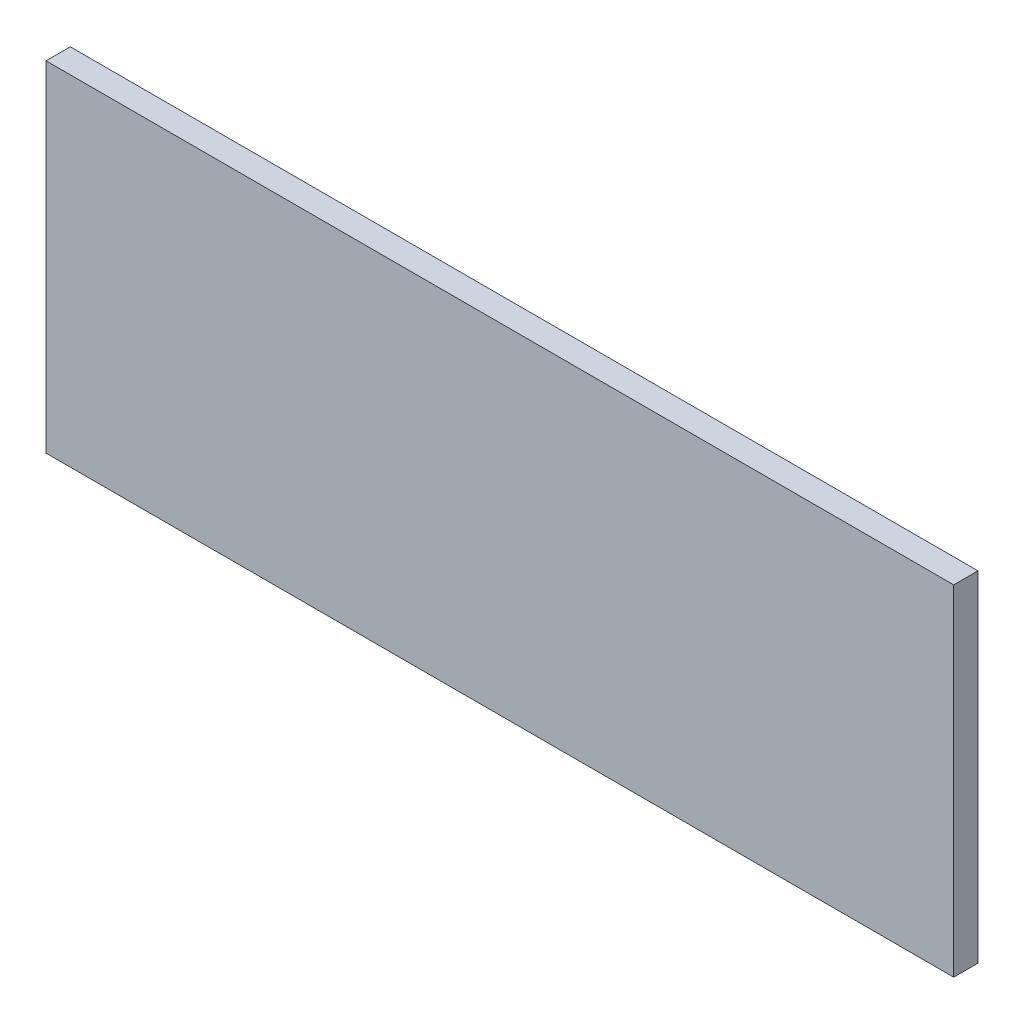
ISO-10303-21;
HEADER;
FILE_DESCRIPTION(('STEP AP214'),'2;1');
FILE_NAME('part.step','',(''),(''),'','','');
FILE_SCHEMA(('AUTOMOTIVE_DESIGN { 1 0 10303 214 1 1 1 1 }'));
ENDSEC;
DATA;
#1=APPLICATION_CONTEXT('core data for automotive mechanical design processes');
#2=APPLICATION_PROTOCOL_DEFINITION('international standard','automotive_design',2000,#1);
#3=PRODUCT_CONTEXT('',#1,'mechanical');
#4=PRODUCT('Part','Part','',(#3));
#5=PRODUCT_RELATED_PRODUCT_CATEGORY('part','',(#4));
#6=PRODUCT_DEFINITION_FORMATION('','',#4);
#7=PRODUCT_DEFINITION_CONTEXT('part definition',#1,'design');
#8=PRODUCT_DEFINITION('design','',#6,#7);
#9=PRODUCT_DEFINITION_SHAPE('','',#8);
#10=(LENGTH_UNIT() NAMED_UNIT(*) SI_UNIT(.MILLI.,.METRE.));
#11=(NAMED_UNIT(*) PLANE_ANGLE_UNIT() SI_UNIT($,.RADIAN.));
#12=(NAMED_UNIT(*) SI_UNIT($,.STERADIAN.) SOLID_ANGLE_UNIT());
#13=UNCERTAINTY_MEASURE_WITH_UNIT(LENGTH_MEASURE(1.E-05),#10,'distance_accuracy_value','');
#14=(GEOMETRIC_REPRESENTATION_CONTEXT(3) GLOBAL_UNCERTAINTY_ASSIGNED_CONTEXT((#13)) GLOBAL_UNIT_ASSIGNED_CONTEXT((#10,
#11,#12)) REPRESENTATION_CONTEXT('',''));
#15=CARTESIAN_POINT('',(0.,0.,0.));
#16=DIRECTION('',(0.,0.,1.));
#17=DIRECTION('',(1.,0.,0.));
#18=AXIS2_PLACEMENT_3D('',#15,#16,#17);
#19=CARTESIAN_POINT('',(0.,0.,10.));
#20=DIRECTION('',(1.,0.,0.));
#21=DIRECTION('',(0.,0.,-1.));
#22=AXIS2_PLACEMENT_3D('',#19,#20,#21);
#23=PLANE('',#22);
#24=DIRECTION('',(0.,-1.,0.));
#25=VECTOR('',#24,1.);
#26=CARTESIAN_POINT('',(0.,0.,0.));
#27=LINE('',#26,#25);
#28=CARTESIAN_POINT('',(0.,140.,0.));
#29=VERTEX_POINT('',#28);
#30=CARTESIAN_POINT('',(0.,0.,0.));
#31=VERTEX_POINT('',#30);
#32=EDGE_CURVE('E96',#29,#31,#27,.T.);
#33=ORIENTED_EDGE('',*,*,#32,.T.);
#34=DIRECTION('',(0.,0.,-1.));
#35=VECTOR('',#34,1.);
#36=CARTESIAN_POINT('',(0.,0.,10.));
#37=LINE('',#36,#35);
#38=CARTESIAN_POINT('',(0.,0.,10.));
#39=VERTEX_POINT('',#38);
#40=EDGE_CURVE('E11',#39,#31,#37,.T.);
#41=ORIENTED_EDGE('',*,*,#40,.F.);
#42=DIRECTION('',(0.,-1.,0.));
#43=VECTOR('',#42,1.);
#44=CARTESIAN_POINT('',(0.,0.,10.));
#45=LINE('',#44,#43);
#46=CARTESIAN_POINT('',(0.,140.,10.));
#47=VERTEX_POINT('',#46);
#48=EDGE_CURVE('E84',#47,#39,#45,.T.);
#49=ORIENTED_EDGE('',*,*,#48,.F.);
#50=DIRECTION('',(0.,0.,-1.));
#51=VECTOR('',#50,1.);
#52=CARTESIAN_POINT('',(0.,140.,10.));
#53=LINE('',#52,#51);
#54=EDGE_CURVE('E92',#47,#29,#53,.T.);
#55=ORIENTED_EDGE('',*,*,#54,.T.);
#56=EDGE_LOOP('',(#33,#41,#49,#55));
#57=FACE_BOUND('',#56,.T.);
#58=ADVANCED_FACE('F33',(#57),#23,.F.);
#59=CARTESIAN_POINT('',(0.,0.,10.));
#60=DIRECTION('',(0.,1.,0.));
#61=DIRECTION('',(0.,0.,1.));
#62=AXIS2_PLACEMENT_3D('',#59,#60,#61);
#63=PLANE('',#62);
#64=DIRECTION('',(1.,0.,0.));
#65=VECTOR('',#64,1.);
#66=CARTESIAN_POINT('',(0.,0.,0.));
#67=LINE('',#66,#65);
#68=CARTESIAN_POINT('',(374.,0.,0.));
#69=VERTEX_POINT('',#68);
#70=EDGE_CURVE('E88',#31,#69,#67,.T.);
#71=ORIENTED_EDGE('',*,*,#70,.T.);
#72=DIRECTION('',(0.,0.,-1.));
#73=VECTOR('',#72,1.);
#74=CARTESIAN_POINT('',(374.,0.,10.));
#75=LINE('',#74,#73);
#76=CARTESIAN_POINT('',(374.,0.,10.));
#77=VERTEX_POINT('',#76);
#78=EDGE_CURVE('E41',#77,#69,#75,.T.);
#79=ORIENTED_EDGE('',*,*,#78,.F.);
#80=DIRECTION('',(1.,0.,0.));
#81=VECTOR('',#80,1.);
#82=CARTESIAN_POINT('',(0.,0.,10.));
#83=LINE('',#82,#81);
#84=EDGE_CURVE('E79',#39,#77,#83,.T.);
#85=ORIENTED_EDGE('',*,*,#84,.F.);
#86=ORIENTED_EDGE('',*,*,#40,.T.);
#87=EDGE_LOOP('',(#71,#79,#85,#86));
#88=FACE_BOUND('',#87,.T.);
#89=ADVANCED_FACE('F87',(#88),#63,.F.);
#90=CARTESIAN_POINT('',(374.,0.,10.));
#91=DIRECTION('',(-1.,0.,0.));
#92=DIRECTION('',(0.,0.,1.));
#93=AXIS2_PLACEMENT_3D('',#90,#91,#92);
#94=PLANE('',#93);
#95=DIRECTION('',(0.,1.,0.));
#96=VECTOR('',#95,1.);
#97=CARTESIAN_POINT('',(374.,0.,0.));
#98=LINE('',#97,#96);
#99=CARTESIAN_POINT('',(374.,140.,0.));
#100=VERTEX_POINT('',#99);
#101=EDGE_CURVE('E66',#69,#100,#98,.T.);
#102=ORIENTED_EDGE('',*,*,#101,.T.);
#103=DIRECTION('',(0.,0.,-1.));
#104=VECTOR('',#103,1.);
#105=CARTESIAN_POINT('',(374.,140.,10.));
#106=LINE('',#105,#104);
#107=CARTESIAN_POINT('',(374.,140.,10.));
#108=VERTEX_POINT('',#107);
#109=EDGE_CURVE('E89',#108,#100,#106,.T.);
#110=ORIENTED_EDGE('',*,*,#109,.F.);
#111=DIRECTION('',(0.,1.,0.));
#112=VECTOR('',#111,1.);
#113=CARTESIAN_POINT('',(374.,0.,10.));
#114=LINE('',#113,#112);
#115=EDGE_CURVE('E82',#77,#108,#114,.T.);
#116=ORIENTED_EDGE('',*,*,#115,.F.);
#117=ORIENTED_EDGE('',*,*,#78,.T.);
#118=EDGE_LOOP('',(#102,#110,#116,#117));
#119=FACE_BOUND('',#118,.T.);
#120=ADVANCED_FACE('F90',(#119),#94,.F.);
#121=CARTESIAN_POINT('',(0.,140.,10.));
#122=DIRECTION('',(0.,-1.,0.));
#123=DIRECTION('',(0.,0.,-1.));
#124=AXIS2_PLACEMENT_3D('',#121,#122,#123);
#125=PLANE('',#124);
#126=DIRECTION('',(-1.,0.,0.));
#127=VECTOR('',#126,1.);
#128=CARTESIAN_POINT('',(0.,140.,0.));
#129=LINE('',#128,#127);
#130=EDGE_CURVE('E72',#100,#29,#129,.T.);
#131=ORIENTED_EDGE('',*,*,#130,.T.);
#132=ORIENTED_EDGE('',*,*,#54,.F.);
#133=DIRECTION('',(-1.,0.,0.));
#134=VECTOR('',#133,1.);
#135=CARTESIAN_POINT('',(0.,140.,10.));
#136=LINE('',#135,#134);
#137=EDGE_CURVE('E49',#108,#47,#136,.T.);
#138=ORIENTED_EDGE('',*,*,#137,.F.);
#139=ORIENTED_EDGE('',*,*,#109,.T.);
#140=EDGE_LOOP('',(#131,#132,#138,#139));
#141=FACE_BOUND('',#140,.T.);
#142=ADVANCED_FACE('F103',(#141),#125,.F.);
#143=CARTESIAN_POINT('',(0.,0.,10.));
#144=DIRECTION('',(0.,0.,-1.));
#145=DIRECTION('',(-1.,0.,0.));
#146=AXIS2_PLACEMENT_3D('',#143,#144,#145);
#147=PLANE('',#146);
#148=ORIENTED_EDGE('',*,*,#48,.T.);
#149=ORIENTED_EDGE('',*,*,#84,.T.);
#150=ORIENTED_EDGE('',*,*,#115,.T.);
#151=ORIENTED_EDGE('',*,*,#137,.T.);
#152=EDGE_LOOP('',(#148,#149,#150,#151));
#153=FACE_BOUND('',#152,.T.);
#154=ADVANCED_FACE('F80',(#153),#147,.F.);
#155=CARTESIAN_POINT('',(0.,0.,0.));
#156=DIRECTION('',(0.,0.,-1.));
#157=DIRECTION('',(-1.,0.,0.));
#158=AXIS2_PLACEMENT_3D('',#155,#156,#157);
#159=PLANE('',#158);
#160=ORIENTED_EDGE('',*,*,#32,.F.);
#161=ORIENTED_EDGE('',*,*,#130,.F.);
#162=ORIENTED_EDGE('',*,*,#101,.F.);
#163=ORIENTED_EDGE('',*,*,#70,.F.);
#164=EDGE_LOOP('',(#160,#161,#162,#163));
#165=FACE_BOUND('',#164,.T.);
#166=ADVANCED_FACE('F106',(#165),#159,.T.);
#167=CLOSED_SHELL('',(#58,#89,#120,#142,#154,#166));
#168=MANIFOLD_SOLID_BREP('B2',#167);
#169=ADVANCED_BREP_SHAPE_REPRESENTATION('',(#18,#168),#14);
#170=SHAPE_DEFINITION_REPRESENTATION(#9,#169);
ENDSEC;
END-ISO-10303-21;
